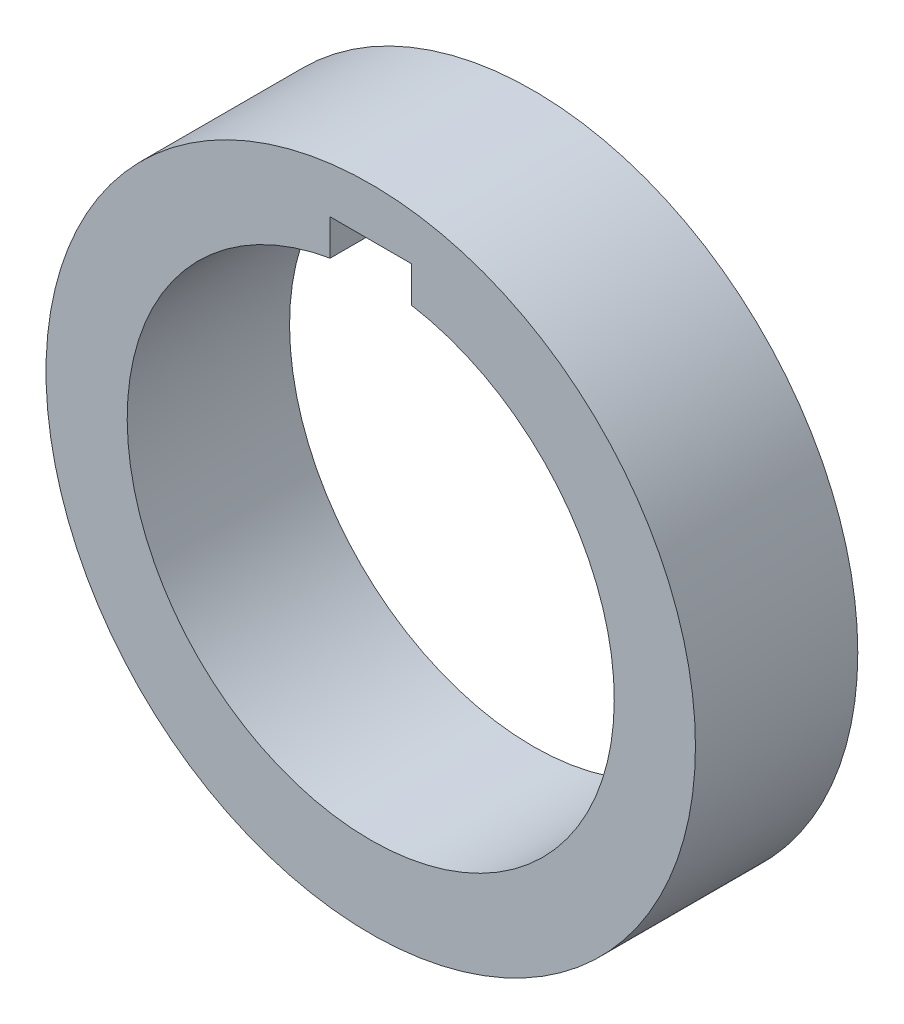
ISO-10303-21;
HEADER;
FILE_DESCRIPTION(('STEP AP214'),'2;1');
FILE_NAME('part.step','',(''),(''),'','','');
FILE_SCHEMA(('AUTOMOTIVE_DESIGN { 1 0 10303 214 1 1 1 1 }'));
ENDSEC;
DATA;
#1=APPLICATION_CONTEXT('core data for automotive mechanical design processes');
#2=APPLICATION_PROTOCOL_DEFINITION('international standard','automotive_design',2000,#1);
#3=PRODUCT_CONTEXT('',#1,'mechanical');
#4=PRODUCT('Part','Part','',(#3));
#5=PRODUCT_RELATED_PRODUCT_CATEGORY('part','',(#4));
#6=PRODUCT_DEFINITION_FORMATION('','',#4);
#7=PRODUCT_DEFINITION_CONTEXT('part definition',#1,'design');
#8=PRODUCT_DEFINITION('design','',#6,#7);
#9=PRODUCT_DEFINITION_SHAPE('','',#8);
#10=(LENGTH_UNIT() NAMED_UNIT(*) SI_UNIT(.MILLI.,.METRE.));
#11=(NAMED_UNIT(*) PLANE_ANGLE_UNIT() SI_UNIT($,.RADIAN.));
#12=(NAMED_UNIT(*) SI_UNIT($,.STERADIAN.) SOLID_ANGLE_UNIT());
#13=UNCERTAINTY_MEASURE_WITH_UNIT(LENGTH_MEASURE(1.E-05),#10,'distance_accuracy_value','');
#14=(GEOMETRIC_REPRESENTATION_CONTEXT(3) GLOBAL_UNCERTAINTY_ASSIGNED_CONTEXT((#13)) GLOBAL_UNIT_ASSIGNED_CONTEXT((#10,
#11,#12)) REPRESENTATION_CONTEXT('',''));
#15=CARTESIAN_POINT('',(0.,0.,0.));
#16=DIRECTION('',(0.,0.,1.));
#17=DIRECTION('',(1.,0.,0.));
#18=AXIS2_PLACEMENT_3D('',#15,#16,#17);
#19=CARTESIAN_POINT('',(0.,0.,10.));
#20=DIRECTION('',(0.,0.,-1.));
#21=DIRECTION('',(-1.,0.,0.));
#22=AXIS2_PLACEMENT_3D('',#19,#20,#21);
#23=CYLINDRICAL_SURFACE('',#22,20.);
#24=CARTESIAN_POINT('',(0.,0.,10.));
#25=DIRECTION('',(0.,0.,1.));
#26=DIRECTION('',(1.,0.,0.));
#27=AXIS2_PLACEMENT_3D('',#24,#25,#26);
#28=CIRCLE('',#27,20.);
#29=CARTESIAN_POINT('',(20.,0.,10.));
#30=VERTEX_POINT('',#29);
#31=EDGE_CURVE('E12',#30,#30,#28,.T.);
#32=ORIENTED_EDGE('',*,*,#31,.F.);
#33=EDGE_LOOP('',(#32));
#34=FACE_BOUND('',#33,.T.);
#35=CARTESIAN_POINT('',(0.,0.,0.));
#36=DIRECTION('',(0.,0.,1.));
#37=DIRECTION('',(1.,0.,0.));
#38=AXIS2_PLACEMENT_3D('',#35,#36,#37);
#39=CIRCLE('',#38,20.);
#40=CARTESIAN_POINT('',(20.,0.,0.));
#41=VERTEX_POINT('',#40);
#42=EDGE_CURVE('E63',#41,#41,#39,.T.);
#43=ORIENTED_EDGE('',*,*,#42,.T.);
#44=EDGE_LOOP('',(#43));
#45=FACE_BOUND('',#44,.T.);
#46=ADVANCED_FACE('F60',(#34,#45),#23,.T.);
#47=CARTESIAN_POINT('',(0.,0.,10.));
#48=DIRECTION('',(0.,0.,1.));
#49=DIRECTION('',(1.,0.,0.));
#50=AXIS2_PLACEMENT_3D('',#47,#48,#49);
#51=PLANE('',#50);
#52=DIRECTION('',(0.,1.,0.));
#53=VECTOR('',#52,1.);
#54=CARTESIAN_POINT('',(-2.5,14.790199457749,10.));
#55=LINE('',#54,#53);
#56=CARTESIAN_POINT('',(-2.5,14.790199457749,10.));
#57=VERTEX_POINT('',#56);
#58=CARTESIAN_POINT('',(-2.5,17.,10.));
#59=VERTEX_POINT('',#58);
#60=EDGE_CURVE('E104',#57,#59,#55,.T.);
#61=ORIENTED_EDGE('',*,*,#60,.T.);
#62=DIRECTION('',(1.,0.,0.));
#63=VECTOR('',#62,1.);
#64=CARTESIAN_POINT('',(-2.5,17.,10.));
#65=LINE('',#64,#63);
#66=CARTESIAN_POINT('',(2.5,17.,10.));
#67=VERTEX_POINT('',#66);
#68=EDGE_CURVE('E114',#59,#67,#65,.T.);
#69=ORIENTED_EDGE('',*,*,#68,.T.);
#70=DIRECTION('',(0.,-1.,0.));
#71=VECTOR('',#70,1.);
#72=CARTESIAN_POINT('',(2.5,17.,10.));
#73=LINE('',#72,#71);
#74=CARTESIAN_POINT('',(2.49999999999999,14.790199457749,10.));
#75=VERTEX_POINT('',#74);
#76=EDGE_CURVE('E75',#67,#75,#73,.T.);
#77=ORIENTED_EDGE('',*,*,#76,.T.);
#78=CARTESIAN_POINT('',(0.,0.,10.));
#79=DIRECTION('',(0.,0.,1.));
#80=DIRECTION('',(1.,0.,0.));
#81=AXIS2_PLACEMENT_3D('',#78,#79,#80);
#82=CIRCLE('',#81,15.);
#83=EDGE_CURVE('E111',#57,#75,#82,.T.);
#84=ORIENTED_EDGE('',*,*,#83,.F.);
#85=EDGE_LOOP('',(#61,#69,#77,#84));
#86=FACE_BOUND('',#85,.T.);
#87=ORIENTED_EDGE('',*,*,#31,.T.);
#88=EDGE_LOOP('',(#87));
#89=FACE_BOUND('',#88,.T.);
#90=ADVANCED_FACE('F119',(#86,#89),#51,.T.);
#91=CARTESIAN_POINT('',(0.,0.,0.));
#92=DIRECTION('',(0.,0.,1.));
#93=DIRECTION('',(1.,0.,0.));
#94=AXIS2_PLACEMENT_3D('',#91,#92,#93);
#95=PLANE('',#94);
#96=DIRECTION('',(1.,0.,0.));
#97=VECTOR('',#96,1.);
#98=CARTESIAN_POINT('',(-2.5,17.,0.));
#99=LINE('',#98,#97);
#100=CARTESIAN_POINT('',(-2.5,17.,0.));
#101=VERTEX_POINT('',#100);
#102=CARTESIAN_POINT('',(2.5,17.,0.));
#103=VERTEX_POINT('',#102);
#104=EDGE_CURVE('E135',#101,#103,#99,.T.);
#105=ORIENTED_EDGE('',*,*,#104,.F.);
#106=DIRECTION('',(0.,1.,0.));
#107=VECTOR('',#106,1.);
#108=CARTESIAN_POINT('',(-2.5,14.790199457749,0.));
#109=LINE('',#108,#107);
#110=CARTESIAN_POINT('',(-2.5,14.790199457749,0.));
#111=VERTEX_POINT('',#110);
#112=EDGE_CURVE('E83',#111,#101,#109,.T.);
#113=ORIENTED_EDGE('',*,*,#112,.F.);
#114=CARTESIAN_POINT('',(0.,0.,0.));
#115=DIRECTION('',(0.,0.,1.));
#116=DIRECTION('',(1.,0.,0.));
#117=AXIS2_PLACEMENT_3D('',#114,#115,#116);
#118=CIRCLE('',#117,15.);
#119=CARTESIAN_POINT('',(2.49999999999999,14.790199457749,0.));
#120=VERTEX_POINT('',#119);
#121=EDGE_CURVE('E122',#111,#120,#118,.T.);
#122=ORIENTED_EDGE('',*,*,#121,.T.);
#123=DIRECTION('',(0.,-1.,0.));
#124=VECTOR('',#123,1.);
#125=CARTESIAN_POINT('',(2.5,17.,0.));
#126=LINE('',#125,#124);
#127=EDGE_CURVE('E126',#103,#120,#126,.T.);
#128=ORIENTED_EDGE('',*,*,#127,.F.);
#129=EDGE_LOOP('',(#105,#113,#122,#128));
#130=FACE_BOUND('',#129,.T.);
#131=ORIENTED_EDGE('',*,*,#42,.F.);
#132=EDGE_LOOP('',(#131));
#133=FACE_BOUND('',#132,.T.);
#134=ADVANCED_FACE('F151',(#130,#133),#95,.F.);
#135=CARTESIAN_POINT('',(-2.5,14.790199457749,10.));
#136=DIRECTION('',(-1.,0.,0.));
#137=DIRECTION('',(0.,-1.,0.));
#138=AXIS2_PLACEMENT_3D('',#135,#136,#137);
#139=PLANE('',#138);
#140=ORIENTED_EDGE('',*,*,#112,.T.);
#141=DIRECTION('',(0.,0.,-1.));
#142=VECTOR('',#141,1.);
#143=CARTESIAN_POINT('',(-2.5,17.,10.));
#144=LINE('',#143,#142);
#145=EDGE_CURVE('E100',#59,#101,#144,.T.);
#146=ORIENTED_EDGE('',*,*,#145,.F.);
#147=ORIENTED_EDGE('',*,*,#60,.F.);
#148=DIRECTION('',(0.,0.,-1.));
#149=VECTOR('',#148,1.);
#150=CARTESIAN_POINT('',(-2.5,14.790199457749,10.));
#151=LINE('',#150,#149);
#152=EDGE_CURVE('E141',#57,#111,#151,.T.);
#153=ORIENTED_EDGE('',*,*,#152,.T.);
#154=EDGE_LOOP('',(#140,#146,#147,#153));
#155=FACE_BOUND('',#154,.T.);
#156=ADVANCED_FACE('F102',(#155),#139,.F.);
#157=CARTESIAN_POINT('',(0.,0.,10.));
#158=DIRECTION('',(0.,0.,-1.));
#159=DIRECTION('',(-1.,0.,0.));
#160=AXIS2_PLACEMENT_3D('',#157,#158,#159);
#161=CYLINDRICAL_SURFACE('',#160,15.);
#162=ORIENTED_EDGE('',*,*,#121,.F.);
#163=ORIENTED_EDGE('',*,*,#152,.F.);
#164=ORIENTED_EDGE('',*,*,#83,.T.);
#165=DIRECTION('',(0.,0.,-1.));
#166=VECTOR('',#165,1.);
#167=CARTESIAN_POINT('',(2.49999999999999,14.790199457749,10.));
#168=LINE('',#167,#166);
#169=EDGE_CURVE('E144',#75,#120,#168,.T.);
#170=ORIENTED_EDGE('',*,*,#169,.T.);
#171=EDGE_LOOP('',(#162,#163,#164,#170));
#172=FACE_BOUND('',#171,.T.);
#173=ADVANCED_FACE('F155',(#172),#161,.F.);
#174=CARTESIAN_POINT('',(2.5,17.,10.));
#175=DIRECTION('',(1.,0.,0.));
#176=DIRECTION('',(0.,1.,0.));
#177=AXIS2_PLACEMENT_3D('',#174,#175,#176);
#178=PLANE('',#177);
#179=ORIENTED_EDGE('',*,*,#127,.T.);
#180=ORIENTED_EDGE('',*,*,#169,.F.);
#181=ORIENTED_EDGE('',*,*,#76,.F.);
#182=DIRECTION('',(0.,0.,-1.));
#183=VECTOR('',#182,1.);
#184=CARTESIAN_POINT('',(2.5,17.,10.));
#185=LINE('',#184,#183);
#186=EDGE_CURVE('E110',#67,#103,#185,.T.);
#187=ORIENTED_EDGE('',*,*,#186,.T.);
#188=EDGE_LOOP('',(#179,#180,#181,#187));
#189=FACE_BOUND('',#188,.T.);
#190=ADVANCED_FACE('F148',(#189),#178,.F.);
#191=CARTESIAN_POINT('',(-2.5,17.,10.));
#192=DIRECTION('',(0.,1.,0.));
#193=DIRECTION('',(0.,0.,1.));
#194=AXIS2_PLACEMENT_3D('',#191,#192,#193);
#195=PLANE('',#194);
#196=ORIENTED_EDGE('',*,*,#104,.T.);
#197=ORIENTED_EDGE('',*,*,#186,.F.);
#198=ORIENTED_EDGE('',*,*,#68,.F.);
#199=ORIENTED_EDGE('',*,*,#145,.T.);
#200=EDGE_LOOP('',(#196,#197,#198,#199));
#201=FACE_BOUND('',#200,.T.);
#202=ADVANCED_FACE('F115',(#201),#195,.F.);
#203=CLOSED_SHELL('',(#46,#90,#134,#156,#173,#190,#202));
#204=MANIFOLD_SOLID_BREP('B2',#203);
#205=ADVANCED_BREP_SHAPE_REPRESENTATION('',(#18,#204),#14);
#206=SHAPE_DEFINITION_REPRESENTATION(#9,#205);
ENDSEC;
END-ISO-10303-21;
